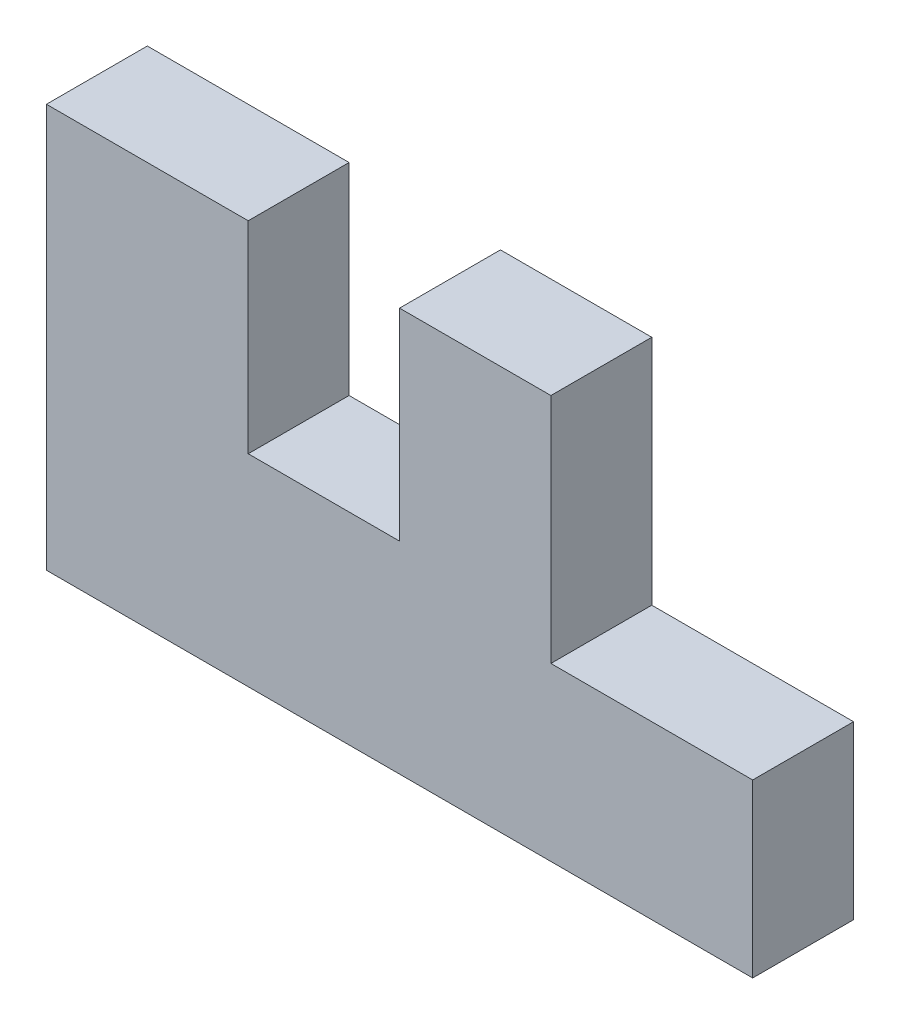
ISO-10303-21;
HEADER;
FILE_DESCRIPTION(('STEP AP214'),'2;1');
FILE_NAME('part.step','',(''),(''),'','','');
FILE_SCHEMA(('AUTOMOTIVE_DESIGN { 1 0 10303 214 1 1 1 1 }'));
ENDSEC;
DATA;
#1=APPLICATION_CONTEXT('core data for automotive mechanical design processes');
#2=APPLICATION_PROTOCOL_DEFINITION('international standard','automotive_design',2000,#1);
#3=PRODUCT_CONTEXT('',#1,'mechanical');
#4=PRODUCT('Part','Part','',(#3));
#5=PRODUCT_RELATED_PRODUCT_CATEGORY('part','',(#4));
#6=PRODUCT_DEFINITION_FORMATION('','',#4);
#7=PRODUCT_DEFINITION_CONTEXT('part definition',#1,'design');
#8=PRODUCT_DEFINITION('design','',#6,#7);
#9=PRODUCT_DEFINITION_SHAPE('','',#8);
#10=(LENGTH_UNIT() NAMED_UNIT(*) SI_UNIT(.MILLI.,.METRE.));
#11=(NAMED_UNIT(*) PLANE_ANGLE_UNIT() SI_UNIT($,.RADIAN.));
#12=(NAMED_UNIT(*) SI_UNIT($,.STERADIAN.) SOLID_ANGLE_UNIT());
#13=UNCERTAINTY_MEASURE_WITH_UNIT(LENGTH_MEASURE(1.E-05),#10,'distance_accuracy_value','');
#14=(GEOMETRIC_REPRESENTATION_CONTEXT(3) GLOBAL_UNCERTAINTY_ASSIGNED_CONTEXT((#13)) GLOBAL_UNIT_ASSIGNED_CONTEXT((#10,
#11,#12)) REPRESENTATION_CONTEXT('',''));
#15=CARTESIAN_POINT('',(0.,0.,0.));
#16=DIRECTION('',(0.,0.,1.));
#17=DIRECTION('',(1.,0.,0.));
#18=AXIS2_PLACEMENT_3D('',#15,#16,#17);
#19=CARTESIAN_POINT('',(0.,0.,12.7));
#20=DIRECTION('',(0.,1.,0.));
#21=DIRECTION('',(0.,0.,1.));
#22=AXIS2_PLACEMENT_3D('',#19,#20,#21);
#23=PLANE('',#22);
#24=DIRECTION('',(1.,0.,0.));
#25=VECTOR('',#24,1.);
#26=CARTESIAN_POINT('',(0.,0.,0.));
#27=LINE('',#26,#25);
#28=CARTESIAN_POINT('',(0.,0.,0.));
#29=VERTEX_POINT('',#28);
#30=CARTESIAN_POINT('',(88.9,0.,0.));
#31=VERTEX_POINT('',#30);
#32=EDGE_CURVE('E145',#29,#31,#27,.T.);
#33=ORIENTED_EDGE('',*,*,#32,.T.);
#34=DIRECTION('',(0.,0.,-1.));
#35=VECTOR('',#34,1.);
#36=CARTESIAN_POINT('',(88.9,0.,12.7));
#37=LINE('',#36,#35);
#38=CARTESIAN_POINT('',(88.9,0.,12.7));
#39=VERTEX_POINT('',#38);
#40=EDGE_CURVE('E11',#39,#31,#37,.T.);
#41=ORIENTED_EDGE('',*,*,#40,.F.);
#42=DIRECTION('',(1.,0.,0.));
#43=VECTOR('',#42,1.);
#44=CARTESIAN_POINT('',(0.,0.,12.7));
#45=LINE('',#44,#43);
#46=CARTESIAN_POINT('',(0.,0.,12.7));
#47=VERTEX_POINT('',#46);
#48=EDGE_CURVE('E163',#47,#39,#45,.T.);
#49=ORIENTED_EDGE('',*,*,#48,.F.);
#50=DIRECTION('',(0.,0.,-1.));
#51=VECTOR('',#50,1.);
#52=CARTESIAN_POINT('',(0.,0.,12.7));
#53=LINE('',#52,#51);
#54=EDGE_CURVE('E141',#47,#29,#53,.T.);
#55=ORIENTED_EDGE('',*,*,#54,.T.);
#56=EDGE_LOOP('',(#33,#41,#49,#55));
#57=FACE_BOUND('',#56,.T.);
#58=ADVANCED_FACE('F37',(#57),#23,.F.);
#59=CARTESIAN_POINT('',(88.9,21.59,12.7));
#60=DIRECTION('',(-1.,0.,0.));
#61=DIRECTION('',(0.,0.,1.));
#62=AXIS2_PLACEMENT_3D('',#59,#60,#61);
#63=PLANE('',#62);
#64=DIRECTION('',(0.,1.,0.));
#65=VECTOR('',#64,1.);
#66=CARTESIAN_POINT('',(88.9,21.59,0.));
#67=LINE('',#66,#65);
#68=CARTESIAN_POINT('',(88.9,21.59,0.));
#69=VERTEX_POINT('',#68);
#70=EDGE_CURVE('E148',#31,#69,#67,.T.);
#71=ORIENTED_EDGE('',*,*,#70,.T.);
#72=DIRECTION('',(0.,0.,-1.));
#73=VECTOR('',#72,1.);
#74=CARTESIAN_POINT('',(88.9,21.59,12.7));
#75=LINE('',#74,#73);
#76=CARTESIAN_POINT('',(88.9,21.59,12.7));
#77=VERTEX_POINT('',#76);
#78=EDGE_CURVE('E45',#77,#69,#75,.T.);
#79=ORIENTED_EDGE('',*,*,#78,.F.);
#80=DIRECTION('',(0.,1.,0.));
#81=VECTOR('',#80,1.);
#82=CARTESIAN_POINT('',(88.9,21.59,12.7));
#83=LINE('',#82,#81);
#84=EDGE_CURVE('E102',#39,#77,#83,.T.);
#85=ORIENTED_EDGE('',*,*,#84,.F.);
#86=ORIENTED_EDGE('',*,*,#40,.T.);
#87=EDGE_LOOP('',(#71,#79,#85,#86));
#88=FACE_BOUND('',#87,.T.);
#89=ADVANCED_FACE('F212',(#88),#63,.F.);
#90=CARTESIAN_POINT('',(63.5,21.59,12.7));
#91=DIRECTION('',(0.,-1.,0.));
#92=DIRECTION('',(0.,0.,-1.));
#93=AXIS2_PLACEMENT_3D('',#90,#91,#92);
#94=PLANE('',#93);
#95=DIRECTION('',(-1.,0.,0.));
#96=VECTOR('',#95,1.);
#97=CARTESIAN_POINT('',(63.5,21.59,0.));
#98=LINE('',#97,#96);
#99=CARTESIAN_POINT('',(63.5,21.59,0.));
#100=VERTEX_POINT('',#99);
#101=EDGE_CURVE('E150',#69,#100,#98,.T.);
#102=ORIENTED_EDGE('',*,*,#101,.T.);
#103=DIRECTION('',(0.,0.,-1.));
#104=VECTOR('',#103,1.);
#105=CARTESIAN_POINT('',(63.5,21.59,12.7));
#106=LINE('',#105,#104);
#107=CARTESIAN_POINT('',(63.5,21.59,12.7));
#108=VERTEX_POINT('',#107);
#109=EDGE_CURVE('E176',#108,#100,#106,.T.);
#110=ORIENTED_EDGE('',*,*,#109,.F.);
#111=DIRECTION('',(-1.,0.,0.));
#112=VECTOR('',#111,1.);
#113=CARTESIAN_POINT('',(63.5,21.59,12.7));
#114=LINE('',#113,#112);
#115=EDGE_CURVE('E184',#77,#108,#114,.T.);
#116=ORIENTED_EDGE('',*,*,#115,.F.);
#117=ORIENTED_EDGE('',*,*,#78,.T.);
#118=EDGE_LOOP('',(#102,#110,#116,#117));
#119=FACE_BOUND('',#118,.T.);
#120=ADVANCED_FACE('F182',(#119),#94,.F.);
#121=CARTESIAN_POINT('',(63.5,50.8,12.7));
#122=DIRECTION('',(-1.,0.,0.));
#123=DIRECTION('',(0.,0.,1.));
#124=AXIS2_PLACEMENT_3D('',#121,#122,#123);
#125=PLANE('',#124);
#126=DIRECTION('',(0.,1.,0.));
#127=VECTOR('',#126,1.);
#128=CARTESIAN_POINT('',(63.5,50.8,0.));
#129=LINE('',#128,#127);
#130=CARTESIAN_POINT('',(63.5,50.8,0.));
#131=VERTEX_POINT('',#130);
#132=EDGE_CURVE('E152',#100,#131,#129,.T.);
#133=ORIENTED_EDGE('',*,*,#132,.T.);
#134=DIRECTION('',(0.,0.,-1.));
#135=VECTOR('',#134,1.);
#136=CARTESIAN_POINT('',(63.5,50.8,12.7));
#137=LINE('',#136,#135);
#138=CARTESIAN_POINT('',(63.5,50.8,12.7));
#139=VERTEX_POINT('',#138);
#140=EDGE_CURVE('E173',#139,#131,#137,.T.);
#141=ORIENTED_EDGE('',*,*,#140,.F.);
#142=DIRECTION('',(0.,1.,0.));
#143=VECTOR('',#142,1.);
#144=CARTESIAN_POINT('',(63.5,50.8,12.7));
#145=LINE('',#144,#143);
#146=EDGE_CURVE('E202',#108,#139,#145,.T.);
#147=ORIENTED_EDGE('',*,*,#146,.F.);
#148=ORIENTED_EDGE('',*,*,#109,.T.);
#149=EDGE_LOOP('',(#133,#141,#147,#148));
#150=FACE_BOUND('',#149,.T.);
#151=ADVANCED_FACE('F193',(#150),#125,.F.);
#152=CARTESIAN_POINT('',(44.45,50.8,12.7));
#153=DIRECTION('',(0.,-1.,0.));
#154=DIRECTION('',(0.,0.,-1.));
#155=AXIS2_PLACEMENT_3D('',#152,#153,#154);
#156=PLANE('',#155);
#157=DIRECTION('',(-1.,0.,0.));
#158=VECTOR('',#157,1.);
#159=CARTESIAN_POINT('',(44.45,50.8,0.));
#160=LINE('',#159,#158);
#161=CARTESIAN_POINT('',(44.45,50.8,0.));
#162=VERTEX_POINT('',#161);
#163=EDGE_CURVE('E154',#131,#162,#160,.T.);
#164=ORIENTED_EDGE('',*,*,#163,.T.);
#165=DIRECTION('',(0.,0.,-1.));
#166=VECTOR('',#165,1.);
#167=CARTESIAN_POINT('',(44.45,50.8,12.7));
#168=LINE('',#167,#166);
#169=CARTESIAN_POINT('',(44.45,50.8,12.7));
#170=VERTEX_POINT('',#169);
#171=EDGE_CURVE('E170',#170,#162,#168,.T.);
#172=ORIENTED_EDGE('',*,*,#171,.F.);
#173=DIRECTION('',(-1.,0.,0.));
#174=VECTOR('',#173,1.);
#175=CARTESIAN_POINT('',(44.45,50.8,12.7));
#176=LINE('',#175,#174);
#177=EDGE_CURVE('E199',#139,#170,#176,.T.);
#178=ORIENTED_EDGE('',*,*,#177,.F.);
#179=ORIENTED_EDGE('',*,*,#140,.T.);
#180=EDGE_LOOP('',(#164,#172,#178,#179));
#181=FACE_BOUND('',#180,.T.);
#182=ADVANCED_FACE('F197',(#181),#156,.F.);
#183=CARTESIAN_POINT('',(44.45,25.4,12.7));
#184=DIRECTION('',(1.,0.,0.));
#185=DIRECTION('',(0.,0.,-1.));
#186=AXIS2_PLACEMENT_3D('',#183,#184,#185);
#187=PLANE('',#186);
#188=DIRECTION('',(0.,-1.,0.));
#189=VECTOR('',#188,1.);
#190=CARTESIAN_POINT('',(44.45,25.4,0.));
#191=LINE('',#190,#189);
#192=CARTESIAN_POINT('',(44.45,25.4,0.));
#193=VERTEX_POINT('',#192);
#194=EDGE_CURVE('E156',#162,#193,#191,.T.);
#195=ORIENTED_EDGE('',*,*,#194,.T.);
#196=DIRECTION('',(0.,0.,-1.));
#197=VECTOR('',#196,1.);
#198=CARTESIAN_POINT('',(44.45,25.4,12.7));
#199=LINE('',#198,#197);
#200=CARTESIAN_POINT('',(44.45,25.4,12.7));
#201=VERTEX_POINT('',#200);
#202=EDGE_CURVE('E167',#201,#193,#199,.T.);
#203=ORIENTED_EDGE('',*,*,#202,.F.);
#204=DIRECTION('',(0.,-1.,0.));
#205=VECTOR('',#204,1.);
#206=CARTESIAN_POINT('',(44.45,25.4,12.7));
#207=LINE('',#206,#205);
#208=EDGE_CURVE('E201',#170,#201,#207,.T.);
#209=ORIENTED_EDGE('',*,*,#208,.F.);
#210=ORIENTED_EDGE('',*,*,#171,.T.);
#211=EDGE_LOOP('',(#195,#203,#209,#210));
#212=FACE_BOUND('',#211,.T.);
#213=ADVANCED_FACE('F224',(#212),#187,.F.);
#214=CARTESIAN_POINT('',(25.4,25.4,12.7));
#215=DIRECTION('',(0.,-1.,0.));
#216=DIRECTION('',(0.,0.,-1.));
#217=AXIS2_PLACEMENT_3D('',#214,#215,#216);
#218=PLANE('',#217);
#219=DIRECTION('',(-1.,0.,0.));
#220=VECTOR('',#219,1.);
#221=CARTESIAN_POINT('',(25.4,25.4,0.));
#222=LINE('',#221,#220);
#223=CARTESIAN_POINT('',(25.4,25.4,0.));
#224=VERTEX_POINT('',#223);
#225=EDGE_CURVE('E158',#193,#224,#222,.T.);
#226=ORIENTED_EDGE('',*,*,#225,.T.);
#227=DIRECTION('',(0.,0.,-1.));
#228=VECTOR('',#227,1.);
#229=CARTESIAN_POINT('',(25.4,25.4,12.7));
#230=LINE('',#229,#228);
#231=CARTESIAN_POINT('',(25.4,25.4,12.7));
#232=VERTEX_POINT('',#231);
#233=EDGE_CURVE('E136',#232,#224,#230,.T.);
#234=ORIENTED_EDGE('',*,*,#233,.F.);
#235=DIRECTION('',(-1.,0.,0.));
#236=VECTOR('',#235,1.);
#237=CARTESIAN_POINT('',(25.4,25.4,12.7));
#238=LINE('',#237,#236);
#239=EDGE_CURVE('E127',#201,#232,#238,.T.);
#240=ORIENTED_EDGE('',*,*,#239,.F.);
#241=ORIENTED_EDGE('',*,*,#202,.T.);
#242=EDGE_LOOP('',(#226,#234,#240,#241));
#243=FACE_BOUND('',#242,.T.);
#244=ADVANCED_FACE('F227',(#243),#218,.F.);
#245=CARTESIAN_POINT('',(25.4,50.8,12.7));
#246=DIRECTION('',(-1.,0.,0.));
#247=DIRECTION('',(0.,-1.,0.));
#248=AXIS2_PLACEMENT_3D('',#245,#246,#247);
#249=PLANE('',#248);
#250=DIRECTION('',(0.,1.,0.));
#251=VECTOR('',#250,1.);
#252=CARTESIAN_POINT('',(25.4,50.8,0.));
#253=LINE('',#252,#251);
#254=CARTESIAN_POINT('',(25.4,50.8,0.));
#255=VERTEX_POINT('',#254);
#256=EDGE_CURVE('E135',#224,#255,#253,.T.);
#257=ORIENTED_EDGE('',*,*,#256,.T.);
#258=DIRECTION('',(0.,0.,-1.));
#259=VECTOR('',#258,1.);
#260=CARTESIAN_POINT('',(25.4,50.8,12.7));
#261=LINE('',#260,#259);
#262=CARTESIAN_POINT('',(25.4,50.8,12.7));
#263=VERTEX_POINT('',#262);
#264=EDGE_CURVE('E132',#263,#255,#261,.T.);
#265=ORIENTED_EDGE('',*,*,#264,.F.);
#266=DIRECTION('',(0.,1.,0.));
#267=VECTOR('',#266,1.);
#268=CARTESIAN_POINT('',(25.4,50.8,12.7));
#269=LINE('',#268,#267);
#270=EDGE_CURVE('E121',#232,#263,#269,.T.);
#271=ORIENTED_EDGE('',*,*,#270,.F.);
#272=ORIENTED_EDGE('',*,*,#233,.T.);
#273=EDGE_LOOP('',(#257,#265,#271,#272));
#274=FACE_BOUND('',#273,.T.);
#275=ADVANCED_FACE('F133',(#274),#249,.F.);
#276=CARTESIAN_POINT('',(0.,50.8,12.7));
#277=DIRECTION('',(0.,-1.,0.));
#278=DIRECTION('',(0.,0.,-1.));
#279=AXIS2_PLACEMENT_3D('',#276,#277,#278);
#280=PLANE('',#279);
#281=DIRECTION('',(-1.,0.,0.));
#282=VECTOR('',#281,1.);
#283=CARTESIAN_POINT('',(0.,50.8,0.));
#284=LINE('',#283,#282);
#285=CARTESIAN_POINT('',(0.,50.8,0.));
#286=VERTEX_POINT('',#285);
#287=EDGE_CURVE('E88',#255,#286,#284,.T.);
#288=ORIENTED_EDGE('',*,*,#287,.T.);
#289=DIRECTION('',(0.,0.,-1.));
#290=VECTOR('',#289,1.);
#291=CARTESIAN_POINT('',(0.,50.8,12.7));
#292=LINE('',#291,#290);
#293=CARTESIAN_POINT('',(0.,50.8,12.7));
#294=VERTEX_POINT('',#293);
#295=EDGE_CURVE('E137',#294,#286,#292,.T.);
#296=ORIENTED_EDGE('',*,*,#295,.F.);
#297=DIRECTION('',(-1.,0.,0.));
#298=VECTOR('',#297,1.);
#299=CARTESIAN_POINT('',(0.,50.8,12.7));
#300=LINE('',#299,#298);
#301=EDGE_CURVE('E125',#263,#294,#300,.T.);
#302=ORIENTED_EDGE('',*,*,#301,.F.);
#303=ORIENTED_EDGE('',*,*,#264,.T.);
#304=EDGE_LOOP('',(#288,#296,#302,#303));
#305=FACE_BOUND('',#304,.T.);
#306=ADVANCED_FACE('F139',(#305),#280,.F.);
#307=CARTESIAN_POINT('',(0.,0.,12.7));
#308=DIRECTION('',(1.,0.,0.));
#309=DIRECTION('',(0.,0.,-1.));
#310=AXIS2_PLACEMENT_3D('',#307,#308,#309);
#311=PLANE('',#310);
#312=DIRECTION('',(0.,-1.,0.));
#313=VECTOR('',#312,1.);
#314=CARTESIAN_POINT('',(0.,0.,0.));
#315=LINE('',#314,#313);
#316=EDGE_CURVE('E94',#286,#29,#315,.T.);
#317=ORIENTED_EDGE('',*,*,#316,.T.);
#318=ORIENTED_EDGE('',*,*,#54,.F.);
#319=DIRECTION('',(0.,-1.,0.));
#320=VECTOR('',#319,1.);
#321=CARTESIAN_POINT('',(0.,0.,12.7));
#322=LINE('',#321,#320);
#323=EDGE_CURVE('E53',#294,#47,#322,.T.);
#324=ORIENTED_EDGE('',*,*,#323,.F.);
#325=ORIENTED_EDGE('',*,*,#295,.T.);
#326=EDGE_LOOP('',(#317,#318,#324,#325));
#327=FACE_BOUND('',#326,.T.);
#328=ADVANCED_FACE('F236',(#327),#311,.F.);
#329=CARTESIAN_POINT('',(0.,0.,12.7));
#330=DIRECTION('',(0.,0.,-1.));
#331=DIRECTION('',(-1.,0.,0.));
#332=AXIS2_PLACEMENT_3D('',#329,#330,#331);
#333=PLANE('',#332);
#334=ORIENTED_EDGE('',*,*,#48,.T.);
#335=ORIENTED_EDGE('',*,*,#84,.T.);
#336=ORIENTED_EDGE('',*,*,#115,.T.);
#337=ORIENTED_EDGE('',*,*,#146,.T.);
#338=ORIENTED_EDGE('',*,*,#177,.T.);
#339=ORIENTED_EDGE('',*,*,#208,.T.);
#340=ORIENTED_EDGE('',*,*,#239,.T.);
#341=ORIENTED_EDGE('',*,*,#270,.T.);
#342=ORIENTED_EDGE('',*,*,#301,.T.);
#343=ORIENTED_EDGE('',*,*,#323,.T.);
#344=EDGE_LOOP('',(#334,#335,#336,#337,#338,#339,#340,#341,#342,#343));
#345=FACE_BOUND('',#344,.T.);
#346=ADVANCED_FACE('F123',(#345),#333,.F.);
#347=CARTESIAN_POINT('',(0.,0.,0.));
#348=DIRECTION('',(0.,0.,-1.));
#349=DIRECTION('',(-1.,0.,0.));
#350=AXIS2_PLACEMENT_3D('',#347,#348,#349);
#351=PLANE('',#350);
#352=ORIENTED_EDGE('',*,*,#32,.F.);
#353=ORIENTED_EDGE('',*,*,#316,.F.);
#354=ORIENTED_EDGE('',*,*,#287,.F.);
#355=ORIENTED_EDGE('',*,*,#256,.F.);
#356=ORIENTED_EDGE('',*,*,#225,.F.);
#357=ORIENTED_EDGE('',*,*,#194,.F.);
#358=ORIENTED_EDGE('',*,*,#163,.F.);
#359=ORIENTED_EDGE('',*,*,#132,.F.);
#360=ORIENTED_EDGE('',*,*,#101,.F.);
#361=ORIENTED_EDGE('',*,*,#70,.F.);
#362=EDGE_LOOP('',(#352,#353,#354,#355,#356,#357,#358,#359,#360,#361));
#363=FACE_BOUND('',#362,.T.);
#364=ADVANCED_FACE('F188',(#363),#351,.T.);
#365=CLOSED_SHELL('',(#58,#89,#120,#151,#182,#213,#244,#275,#306,#328,#346,#364));
#366=MANIFOLD_SOLID_BREP('B2',#365);
#367=ADVANCED_BREP_SHAPE_REPRESENTATION('',(#18,#366),#14);
#368=SHAPE_DEFINITION_REPRESENTATION(#9,#367);
ENDSEC;
END-ISO-10303-21;
